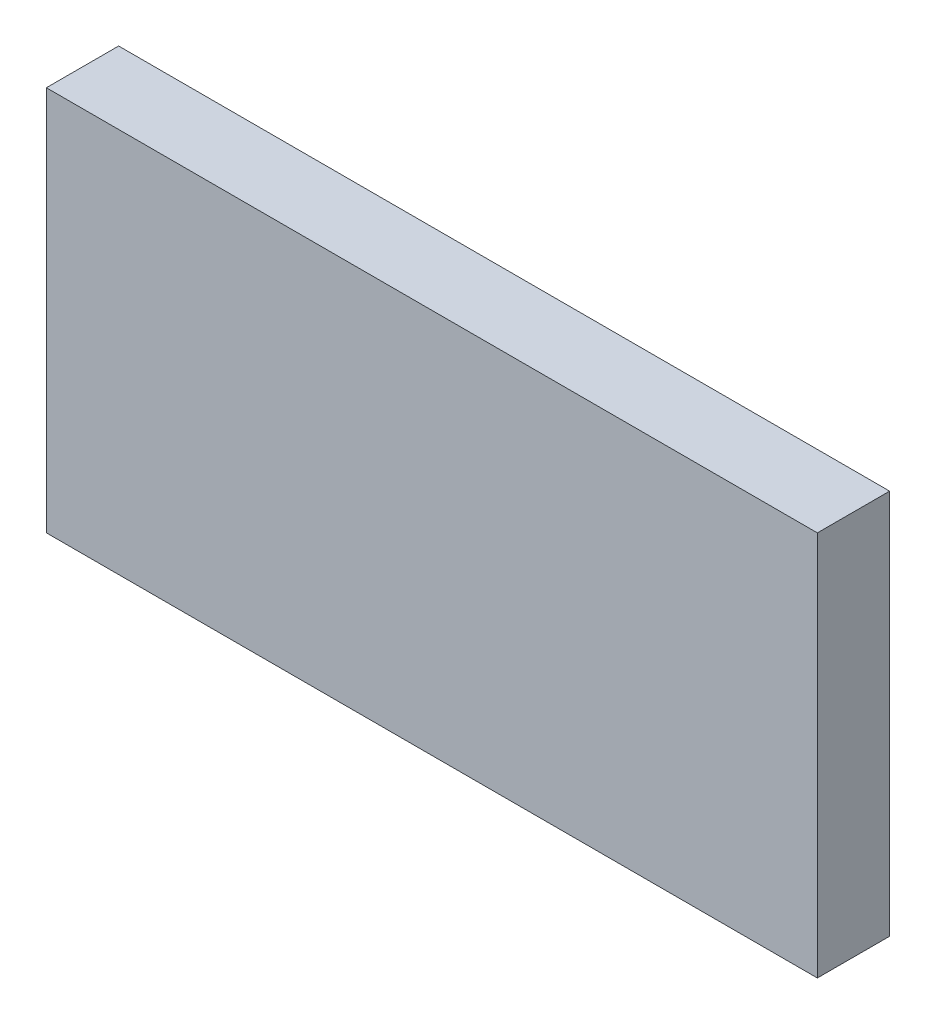
ISO-10303-21;
HEADER;
FILE_DESCRIPTION(('STEP AP214'),'2;1');
FILE_NAME('part.step','',(''),(''),'','','');
FILE_SCHEMA(('AUTOMOTIVE_DESIGN { 1 0 10303 214 1 1 1 1 }'));
ENDSEC;
DATA;
#1=APPLICATION_CONTEXT('core data for automotive mechanical design processes');
#2=APPLICATION_PROTOCOL_DEFINITION('international standard','automotive_design',2000,#1);
#3=PRODUCT_CONTEXT('',#1,'mechanical');
#4=PRODUCT('Part','Part','',(#3));
#5=PRODUCT_RELATED_PRODUCT_CATEGORY('part','',(#4));
#6=PRODUCT_DEFINITION_FORMATION('','',#4);
#7=PRODUCT_DEFINITION_CONTEXT('part definition',#1,'design');
#8=PRODUCT_DEFINITION('design','',#6,#7);
#9=PRODUCT_DEFINITION_SHAPE('','',#8);
#10=(LENGTH_UNIT() NAMED_UNIT(*) SI_UNIT(.MILLI.,.METRE.));
#11=(NAMED_UNIT(*) PLANE_ANGLE_UNIT() SI_UNIT($,.RADIAN.));
#12=(NAMED_UNIT(*) SI_UNIT($,.STERADIAN.) SOLID_ANGLE_UNIT());
#13=UNCERTAINTY_MEASURE_WITH_UNIT(LENGTH_MEASURE(1.E-05),#10,'distance_accuracy_value','');
#14=(GEOMETRIC_REPRESENTATION_CONTEXT(3) GLOBAL_UNCERTAINTY_ASSIGNED_CONTEXT((#13)) GLOBAL_UNIT_ASSIGNED_CONTEXT((#10,
#11,#12)) REPRESENTATION_CONTEXT('',''));
#15=CARTESIAN_POINT('',(0.,0.,0.));
#16=DIRECTION('',(0.,0.,1.));
#17=DIRECTION('',(1.,0.,0.));
#18=AXIS2_PLACEMENT_3D('',#15,#16,#17);
#19=CARTESIAN_POINT('',(80.,-40.,15.));
#20=DIRECTION('',(-1.,0.,0.));
#21=DIRECTION('',(0.,0.,1.));
#22=AXIS2_PLACEMENT_3D('',#19,#20,#21);
#23=PLANE('',#22);
#24=DIRECTION('',(0.,1.,0.));
#25=VECTOR('',#24,1.);
#26=CARTESIAN_POINT('',(80.,-40.,0.));
#27=LINE('',#26,#25);
#28=CARTESIAN_POINT('',(80.,-40.,0.));
#29=VERTEX_POINT('',#28);
#30=CARTESIAN_POINT('',(80.,40.,0.));
#31=VERTEX_POINT('',#30);
#32=EDGE_CURVE('E96',#29,#31,#27,.T.);
#33=ORIENTED_EDGE('',*,*,#32,.T.);
#34=DIRECTION('',(0.,0.,-1.));
#35=VECTOR('',#34,1.);
#36=CARTESIAN_POINT('',(80.,40.,15.));
#37=LINE('',#36,#35);
#38=CARTESIAN_POINT('',(80.,40.,15.));
#39=VERTEX_POINT('',#38);
#40=EDGE_CURVE('E11',#39,#31,#37,.T.);
#41=ORIENTED_EDGE('',*,*,#40,.F.);
#42=DIRECTION('',(0.,1.,0.));
#43=VECTOR('',#42,1.);
#44=CARTESIAN_POINT('',(80.,-40.,15.));
#45=LINE('',#44,#43);
#46=CARTESIAN_POINT('',(80.,-40.,15.));
#47=VERTEX_POINT('',#46);
#48=EDGE_CURVE('E84',#47,#39,#45,.T.);
#49=ORIENTED_EDGE('',*,*,#48,.F.);
#50=DIRECTION('',(0.,0.,-1.));
#51=VECTOR('',#50,1.);
#52=CARTESIAN_POINT('',(80.,-40.,15.));
#53=LINE('',#52,#51);
#54=EDGE_CURVE('E92',#47,#29,#53,.T.);
#55=ORIENTED_EDGE('',*,*,#54,.T.);
#56=EDGE_LOOP('',(#33,#41,#49,#55));
#57=FACE_BOUND('',#56,.T.);
#58=ADVANCED_FACE('F33',(#57),#23,.F.);
#59=CARTESIAN_POINT('',(-80.,40.,15.));
#60=DIRECTION('',(0.,-1.,0.));
#61=DIRECTION('',(0.,0.,-1.));
#62=AXIS2_PLACEMENT_3D('',#59,#60,#61);
#63=PLANE('',#62);
#64=DIRECTION('',(-1.,0.,0.));
#65=VECTOR('',#64,1.);
#66=CARTESIAN_POINT('',(-80.,40.,0.));
#67=LINE('',#66,#65);
#68=CARTESIAN_POINT('',(-80.,40.,0.));
#69=VERTEX_POINT('',#68);
#70=EDGE_CURVE('E88',#31,#69,#67,.T.);
#71=ORIENTED_EDGE('',*,*,#70,.T.);
#72=DIRECTION('',(0.,0.,-1.));
#73=VECTOR('',#72,1.);
#74=CARTESIAN_POINT('',(-80.,40.,15.));
#75=LINE('',#74,#73);
#76=CARTESIAN_POINT('',(-80.,40.,15.));
#77=VERTEX_POINT('',#76);
#78=EDGE_CURVE('E41',#77,#69,#75,.T.);
#79=ORIENTED_EDGE('',*,*,#78,.F.);
#80=DIRECTION('',(-1.,0.,0.));
#81=VECTOR('',#80,1.);
#82=CARTESIAN_POINT('',(-80.,40.,15.));
#83=LINE('',#82,#81);
#84=EDGE_CURVE('E79',#39,#77,#83,.T.);
#85=ORIENTED_EDGE('',*,*,#84,.F.);
#86=ORIENTED_EDGE('',*,*,#40,.T.);
#87=EDGE_LOOP('',(#71,#79,#85,#86));
#88=FACE_BOUND('',#87,.T.);
#89=ADVANCED_FACE('F87',(#88),#63,.F.);
#90=CARTESIAN_POINT('',(-80.,-40.,15.));
#91=DIRECTION('',(1.,0.,0.));
#92=DIRECTION('',(0.,0.,-1.));
#93=AXIS2_PLACEMENT_3D('',#90,#91,#92);
#94=PLANE('',#93);
#95=DIRECTION('',(0.,-1.,0.));
#96=VECTOR('',#95,1.);
#97=CARTESIAN_POINT('',(-80.,-40.,0.));
#98=LINE('',#97,#96);
#99=CARTESIAN_POINT('',(-80.,-40.,0.));
#100=VERTEX_POINT('',#99);
#101=EDGE_CURVE('E66',#69,#100,#98,.T.);
#102=ORIENTED_EDGE('',*,*,#101,.T.);
#103=DIRECTION('',(0.,0.,-1.));
#104=VECTOR('',#103,1.);
#105=CARTESIAN_POINT('',(-80.,-40.,15.));
#106=LINE('',#105,#104);
#107=CARTESIAN_POINT('',(-80.,-40.,15.));
#108=VERTEX_POINT('',#107);
#109=EDGE_CURVE('E89',#108,#100,#106,.T.);
#110=ORIENTED_EDGE('',*,*,#109,.F.);
#111=DIRECTION('',(0.,-1.,0.));
#112=VECTOR('',#111,1.);
#113=CARTESIAN_POINT('',(-80.,-40.,15.));
#114=LINE('',#113,#112);
#115=EDGE_CURVE('E82',#77,#108,#114,.T.);
#116=ORIENTED_EDGE('',*,*,#115,.F.);
#117=ORIENTED_EDGE('',*,*,#78,.T.);
#118=EDGE_LOOP('',(#102,#110,#116,#117));
#119=FACE_BOUND('',#118,.T.);
#120=ADVANCED_FACE('F90',(#119),#94,.F.);
#121=CARTESIAN_POINT('',(-80.,-40.,15.));
#122=DIRECTION('',(0.,1.,0.));
#123=DIRECTION('',(0.,0.,1.));
#124=AXIS2_PLACEMENT_3D('',#121,#122,#123);
#125=PLANE('',#124);
#126=DIRECTION('',(1.,0.,0.));
#127=VECTOR('',#126,1.);
#128=CARTESIAN_POINT('',(-80.,-40.,0.));
#129=LINE('',#128,#127);
#130=EDGE_CURVE('E72',#100,#29,#129,.T.);
#131=ORIENTED_EDGE('',*,*,#130,.T.);
#132=ORIENTED_EDGE('',*,*,#54,.F.);
#133=DIRECTION('',(1.,0.,0.));
#134=VECTOR('',#133,1.);
#135=CARTESIAN_POINT('',(-80.,-40.,15.));
#136=LINE('',#135,#134);
#137=EDGE_CURVE('E49',#108,#47,#136,.T.);
#138=ORIENTED_EDGE('',*,*,#137,.F.);
#139=ORIENTED_EDGE('',*,*,#109,.T.);
#140=EDGE_LOOP('',(#131,#132,#138,#139));
#141=FACE_BOUND('',#140,.T.);
#142=ADVANCED_FACE('F103',(#141),#125,.F.);
#143=CARTESIAN_POINT('',(0.,0.,15.));
#144=DIRECTION('',(0.,0.,-1.));
#145=DIRECTION('',(-1.,0.,0.));
#146=AXIS2_PLACEMENT_3D('',#143,#144,#145);
#147=PLANE('',#146);
#148=ORIENTED_EDGE('',*,*,#48,.T.);
#149=ORIENTED_EDGE('',*,*,#84,.T.);
#150=ORIENTED_EDGE('',*,*,#115,.T.);
#151=ORIENTED_EDGE('',*,*,#137,.T.);
#152=EDGE_LOOP('',(#148,#149,#150,#151));
#153=FACE_BOUND('',#152,.T.);
#154=ADVANCED_FACE('F80',(#153),#147,.F.);
#155=CARTESIAN_POINT('',(0.,0.,0.));
#156=DIRECTION('',(0.,0.,-1.));
#157=DIRECTION('',(-1.,0.,0.));
#158=AXIS2_PLACEMENT_3D('',#155,#156,#157);
#159=PLANE('',#158);
#160=ORIENTED_EDGE('',*,*,#32,.F.);
#161=ORIENTED_EDGE('',*,*,#130,.F.);
#162=ORIENTED_EDGE('',*,*,#101,.F.);
#163=ORIENTED_EDGE('',*,*,#70,.F.);
#164=EDGE_LOOP('',(#160,#161,#162,#163));
#165=FACE_BOUND('',#164,.T.);
#166=ADVANCED_FACE('F106',(#165),#159,.T.);
#167=CLOSED_SHELL('',(#58,#89,#120,#142,#154,#166));
#168=MANIFOLD_SOLID_BREP('B2',#167);
#169=ADVANCED_BREP_SHAPE_REPRESENTATION('',(#18,#168),#14);
#170=SHAPE_DEFINITION_REPRESENTATION(#9,#169);
ENDSEC;
END-ISO-10303-21;
